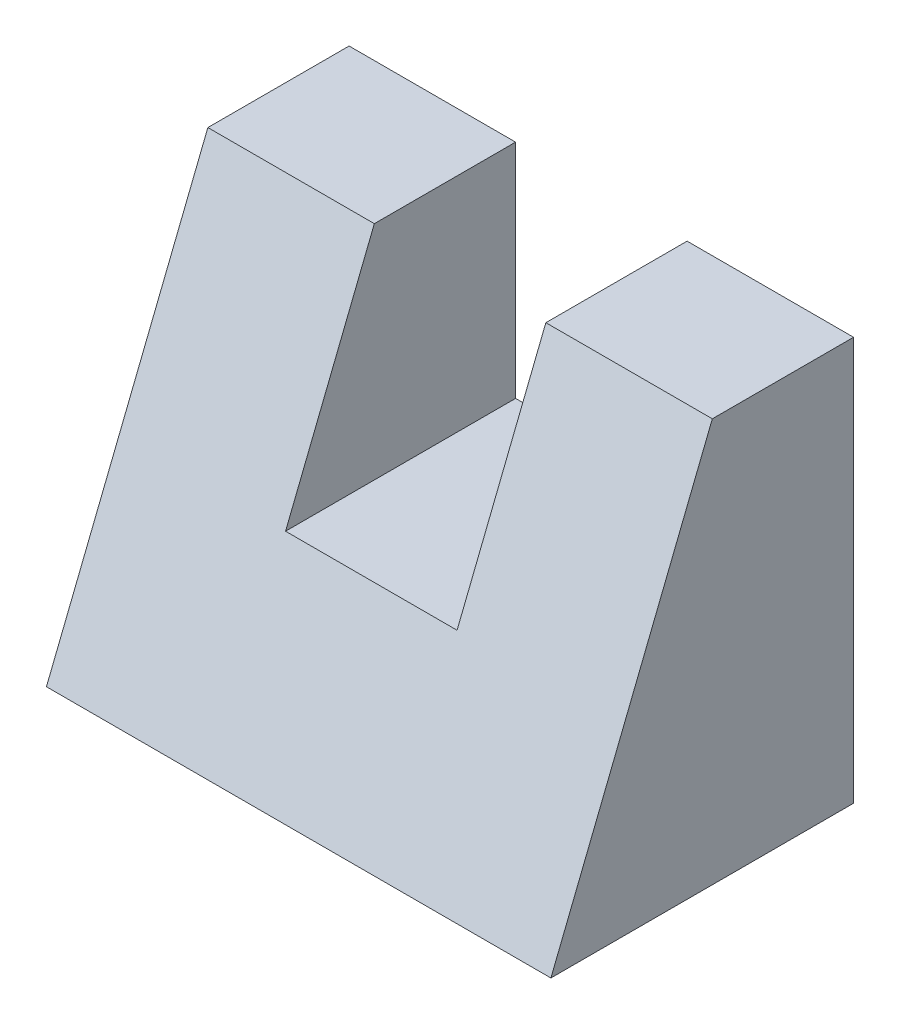
ISO-10303-21;
HEADER;
FILE_DESCRIPTION(('STEP AP214'),'2;1');
FILE_NAME('part.step','',(''),(''),'','','');
FILE_SCHEMA(('AUTOMOTIVE_DESIGN { 1 0 10303 214 1 1 1 1 }'));
ENDSEC;
DATA;
#1=APPLICATION_CONTEXT('core data for automotive mechanical design processes');
#2=APPLICATION_PROTOCOL_DEFINITION('international standard','automotive_design',2000,#1);
#3=PRODUCT_CONTEXT('',#1,'mechanical');
#4=PRODUCT('Part','Part','',(#3));
#5=PRODUCT_RELATED_PRODUCT_CATEGORY('part','',(#4));
#6=PRODUCT_DEFINITION_FORMATION('','',#4);
#7=PRODUCT_DEFINITION_CONTEXT('part definition',#1,'design');
#8=PRODUCT_DEFINITION('design','',#6,#7);
#9=PRODUCT_DEFINITION_SHAPE('','',#8);
#10=(LENGTH_UNIT() NAMED_UNIT(*) SI_UNIT(.MILLI.,.METRE.));
#11=(NAMED_UNIT(*) PLANE_ANGLE_UNIT() SI_UNIT($,.RADIAN.));
#12=(NAMED_UNIT(*) SI_UNIT($,.STERADIAN.) SOLID_ANGLE_UNIT());
#13=UNCERTAINTY_MEASURE_WITH_UNIT(LENGTH_MEASURE(1.E-05),#10,'distance_accuracy_value','');
#14=(GEOMETRIC_REPRESENTATION_CONTEXT(3) GLOBAL_UNCERTAINTY_ASSIGNED_CONTEXT((#13)) GLOBAL_UNIT_ASSIGNED_CONTEXT((#10,
#11,#12)) REPRESENTATION_CONTEXT('',''));
#15=CARTESIAN_POINT('',(0.,0.,0.));
#16=DIRECTION('',(0.,0.,1.));
#17=DIRECTION('',(1.,0.,0.));
#18=AXIS2_PLACEMENT_3D('',#15,#16,#17);
#19=CARTESIAN_POINT('',(0.,80.,0.));
#20=DIRECTION('',(0.,-1.,0.));
#21=DIRECTION('',(0.,0.,-1.));
#22=AXIS2_PLACEMENT_3D('',#19,#20,#21);
#23=PLANE('',#22);
#24=CARTESIAN_POINT('',(0.,80.,28.));
#25=DIRECTION('',(1.,0.,0.));
#26=VECTOR('',#25,1.);
#27=LINE('',#24,#26);
#28=CARTESIAN_POINT('',(0.,80.,28.));
#29=VERTEX_POINT('',#28);
#30=CARTESIAN_POINT('',(33.,80.,28.));
#31=VERTEX_POINT('',#30);
#32=EDGE_CURVE('E350',#29,#31,#27,.T.);
#33=ORIENTED_EDGE('',*,*,#32,.T.);
#34=DIRECTION('',(0.,0.,-1.));
#35=VECTOR('',#34,1.);
#36=CARTESIAN_POINT('',(33.,80.,0.));
#37=LINE('',#36,#35);
#38=CARTESIAN_POINT('',(33.,80.,0.));
#39=VERTEX_POINT('',#38);
#40=EDGE_CURVE('E139',#31,#39,#37,.T.);
#41=ORIENTED_EDGE('',*,*,#40,.T.);
#42=CARTESIAN_POINT('',(0.,80.,0.));
#43=DIRECTION('',(1.,0.,0.));
#44=VECTOR('',#43,1.);
#45=LINE('',#42,#44);
#46=CARTESIAN_POINT('',(0.,80.,0.));
#47=VERTEX_POINT('',#46);
#48=EDGE_CURVE('E360',#47,#39,#45,.T.);
#49=ORIENTED_EDGE('',*,*,#48,.F.);
#50=DIRECTION('',(0.,0.,1.));
#51=VECTOR('',#50,1.);
#52=CARTESIAN_POINT('',(0.,80.,0.));
#53=LINE('',#52,#51);
#54=EDGE_CURVE('E214',#47,#29,#53,.T.);
#55=ORIENTED_EDGE('',*,*,#54,.T.);
#56=EDGE_LOOP('',(#33,#41,#49,#55));
#57=FACE_BOUND('',#56,.T.);
#58=ADVANCED_FACE('F61',(#57),#23,.F.);
#59=CARTESIAN_POINT('',(100.,0.,0.));
#60=DIRECTION('',(1.,0.,0.));
#61=DIRECTION('',(0.,0.,-1.));
#62=AXIS2_PLACEMENT_3D('',#59,#60,#61);
#63=PLANE('',#62);
#64=DIRECTION('',(0.,0.,-1.));
#65=VECTOR('',#64,1.);
#66=CARTESIAN_POINT('',(100.,0.,60.));
#67=LINE('',#66,#65);
#68=CARTESIAN_POINT('',(100.,0.,60.));
#69=VERTEX_POINT('',#68);
#70=CARTESIAN_POINT('',(100.,0.,0.));
#71=VERTEX_POINT('',#70);
#72=EDGE_CURVE('E346',#69,#71,#67,.T.);
#73=ORIENTED_EDGE('',*,*,#72,.T.);
#74=DIRECTION('',(0.,1.,0.));
#75=VECTOR('',#74,1.);
#76=CARTESIAN_POINT('',(100.,0.,0.));
#77=LINE('',#76,#75);
#78=CARTESIAN_POINT('',(100.,80.,0.));
#79=VERTEX_POINT('',#78);
#80=EDGE_CURVE('E341',#71,#79,#77,.T.);
#81=ORIENTED_EDGE('',*,*,#80,.T.);
#82=DIRECTION('',(0.,0.,1.));
#83=VECTOR('',#82,1.);
#84=CARTESIAN_POINT('',(100.,80.,0.));
#85=LINE('',#84,#83);
#86=CARTESIAN_POINT('',(100.,80.,28.));
#87=VERTEX_POINT('',#86);
#88=EDGE_CURVE('E327',#79,#87,#85,.T.);
#89=ORIENTED_EDGE('',*,*,#88,.T.);
#90=DIRECTION('',(0.,-0.928476690885259,0.371390676354104));
#91=VECTOR('',#90,1.);
#92=CARTESIAN_POINT('',(100.,80.,28.));
#93=LINE('',#92,#91);
#94=EDGE_CURVE('E89',#87,#69,#93,.T.);
#95=ORIENTED_EDGE('',*,*,#94,.T.);
#96=EDGE_LOOP('',(#73,#81,#89,#95));
#97=FACE_BOUND('',#96,.T.);
#98=ADVANCED_FACE('F63',(#97),#63,.T.);
#99=CARTESIAN_POINT('',(0.,0.,0.));
#100=DIRECTION('',(1.,0.,0.));
#101=DIRECTION('',(0.,0.,-1.));
#102=AXIS2_PLACEMENT_3D('',#99,#100,#101);
#103=PLANE('',#102);
#104=DIRECTION('',(0.,0.,-1.));
#105=VECTOR('',#104,1.);
#106=CARTESIAN_POINT('',(0.,0.,60.));
#107=LINE('',#106,#105);
#108=CARTESIAN_POINT('',(0.,0.,60.));
#109=VERTEX_POINT('',#108);
#110=CARTESIAN_POINT('',(0.,0.,0.));
#111=VERTEX_POINT('',#110);
#112=EDGE_CURVE('E155',#109,#111,#107,.T.);
#113=ORIENTED_EDGE('',*,*,#112,.F.);
#114=DIRECTION('',(0.,-0.928476690885259,0.371390676354104));
#115=VECTOR('',#114,1.);
#116=CARTESIAN_POINT('',(0.,80.,28.));
#117=LINE('',#116,#115);
#118=EDGE_CURVE('E286',#29,#109,#117,.T.);
#119=ORIENTED_EDGE('',*,*,#118,.F.);
#120=ORIENTED_EDGE('',*,*,#54,.F.);
#121=DIRECTION('',(0.,1.,0.));
#122=VECTOR('',#121,1.);
#123=CARTESIAN_POINT('',(0.,0.,0.));
#124=LINE('',#123,#122);
#125=EDGE_CURVE('E158',#111,#47,#124,.T.);
#126=ORIENTED_EDGE('',*,*,#125,.F.);
#127=EDGE_LOOP('',(#113,#119,#120,#126));
#128=FACE_BOUND('',#127,.T.);
#129=ADVANCED_FACE('F186',(#128),#103,.F.);
#130=CARTESIAN_POINT('',(0.,0.,0.));
#131=DIRECTION('',(0.,0.,1.));
#132=DIRECTION('',(1.,0.,0.));
#133=AXIS2_PLACEMENT_3D('',#130,#131,#132);
#134=PLANE('',#133);
#135=ORIENTED_EDGE('',*,*,#48,.T.);
#136=DIRECTION('',(0.,-1.,0.));
#137=VECTOR('',#136,1.);
#138=CARTESIAN_POINT('',(33.,0.,0.));
#139=LINE('',#138,#137);
#140=CARTESIAN_POINT('',(33.,36.,0.));
#141=VERTEX_POINT('',#140);
#142=EDGE_CURVE('E154',#39,#141,#139,.T.);
#143=ORIENTED_EDGE('',*,*,#142,.T.);
#144=DIRECTION('',(1.,0.,0.));
#145=VECTOR('',#144,1.);
#146=CARTESIAN_POINT('',(0.,36.,0.));
#147=LINE('',#146,#145);
#148=CARTESIAN_POINT('',(67.,36.,0.));
#149=VERTEX_POINT('',#148);
#150=EDGE_CURVE('E145',#141,#149,#147,.T.);
#151=ORIENTED_EDGE('',*,*,#150,.T.);
#152=DIRECTION('',(0.,1.,0.));
#153=VECTOR('',#152,1.);
#154=CARTESIAN_POINT('',(67.,0.,0.));
#155=LINE('',#154,#153);
#156=CARTESIAN_POINT('',(67.,80.,0.));
#157=VERTEX_POINT('',#156);
#158=EDGE_CURVE('E132',#149,#157,#155,.T.);
#159=ORIENTED_EDGE('',*,*,#158,.T.);
#160=CARTESIAN_POINT('',(67.,80.,0.));
#161=DIRECTION('',(1.,0.,0.));
#162=VECTOR('',#161,1.);
#163=LINE('',#160,#162);
#164=EDGE_CURVE('E361',#157,#79,#163,.T.);
#165=ORIENTED_EDGE('',*,*,#164,.T.);
#166=ORIENTED_EDGE('',*,*,#80,.F.);
#167=CARTESIAN_POINT('',(0.,0.,0.));
#168=DIRECTION('',(1.,0.,0.));
#169=VECTOR('',#168,1.);
#170=LINE('',#167,#169);
#171=EDGE_CURVE('E170',#111,#71,#170,.T.);
#172=ORIENTED_EDGE('',*,*,#171,.F.);
#173=ORIENTED_EDGE('',*,*,#125,.T.);
#174=EDGE_LOOP('',(#135,#143,#151,#159,#165,#166,#172,#173));
#175=FACE_BOUND('',#174,.T.);
#176=ADVANCED_FACE('F153',(#175),#134,.F.);
#177=CARTESIAN_POINT('',(0.,0.,0.));
#178=DIRECTION('',(0.,1.,0.));
#179=DIRECTION('',(0.,0.,1.));
#180=AXIS2_PLACEMENT_3D('',#177,#178,#179);
#181=PLANE('',#180);
#182=ORIENTED_EDGE('',*,*,#171,.T.);
#183=ORIENTED_EDGE('',*,*,#72,.F.);
#184=CARTESIAN_POINT('',(0.,0.,60.));
#185=DIRECTION('',(1.,0.,0.));
#186=VECTOR('',#185,1.);
#187=LINE('',#184,#186);
#188=EDGE_CURVE('E276',#109,#69,#187,.T.);
#189=ORIENTED_EDGE('',*,*,#188,.F.);
#190=ORIENTED_EDGE('',*,*,#112,.T.);
#191=EDGE_LOOP('',(#182,#183,#189,#190));
#192=FACE_BOUND('',#191,.T.);
#193=ADVANCED_FACE('F185',(#192),#181,.F.);
#194=ORIENTED_EDGE('',*,*,#164,.F.);
#195=DIRECTION('',(0.,0.,1.));
#196=VECTOR('',#195,1.);
#197=CARTESIAN_POINT('',(67.,80.,0.));
#198=LINE('',#197,#196);
#199=CARTESIAN_POINT('',(67.,80.,28.));
#200=VERTEX_POINT('',#199);
#201=EDGE_CURVE('E135',#157,#200,#198,.T.);
#202=ORIENTED_EDGE('',*,*,#201,.T.);
#203=CARTESIAN_POINT('',(67.,80.,28.));
#204=DIRECTION('',(1.,0.,0.));
#205=VECTOR('',#204,1.);
#206=LINE('',#203,#205);
#207=EDGE_CURVE('E256',#200,#87,#206,.T.);
#208=ORIENTED_EDGE('',*,*,#207,.T.);
#209=ORIENTED_EDGE('',*,*,#88,.F.);
#210=EDGE_LOOP('',(#194,#202,#208,#209));
#211=FACE_BOUND('',#210,.T.);
#212=ADVANCED_FACE('F220',(#211),#23,.F.);
#213=CARTESIAN_POINT('',(0.,20.6896551724138,51.7241379310345));
#214=DIRECTION('',(0.,-0.371390676354104,-0.928476690885259));
#215=DIRECTION('',(0.,0.928476690885259,-0.371390676354104));
#216=AXIS2_PLACEMENT_3D('',#213,#214,#215);
#217=PLANE('',#216);
#218=DIRECTION('',(-1.,0.,0.));
#219=VECTOR('',#218,1.);
#220=CARTESIAN_POINT('',(0.,36.,45.6));
#221=LINE('',#220,#219);
#222=CARTESIAN_POINT('',(67.,36.,45.6));
#223=VERTEX_POINT('',#222);
#224=CARTESIAN_POINT('',(33.,36.,45.6));
#225=VERTEX_POINT('',#224);
#226=EDGE_CURVE('E72',#223,#225,#221,.T.);
#227=ORIENTED_EDGE('',*,*,#226,.T.);
#228=DIRECTION('',(0.,0.928476690885259,-0.371390676354104));
#229=VECTOR('',#228,1.);
#230=CARTESIAN_POINT('',(33.,20.6896551724138,51.7241379310345));
#231=LINE('',#230,#229);
#232=EDGE_CURVE('E12',#225,#31,#231,.T.);
#233=ORIENTED_EDGE('',*,*,#232,.T.);
#234=ORIENTED_EDGE('',*,*,#32,.F.);
#235=ORIENTED_EDGE('',*,*,#118,.T.);
#236=ORIENTED_EDGE('',*,*,#188,.T.);
#237=ORIENTED_EDGE('',*,*,#94,.F.);
#238=ORIENTED_EDGE('',*,*,#207,.F.);
#239=DIRECTION('',(0.,-0.928476690885259,0.371390676354104));
#240=VECTOR('',#239,1.);
#241=CARTESIAN_POINT('',(67.,20.6896551724138,51.7241379310345));
#242=LINE('',#241,#240);
#243=EDGE_CURVE('E262',#200,#223,#242,.T.);
#244=ORIENTED_EDGE('',*,*,#243,.T.);
#245=EDGE_LOOP('',(#227,#233,#234,#235,#236,#237,#238,#244));
#246=FACE_BOUND('',#245,.T.);
#247=ADVANCED_FACE('F228',(#246),#217,.F.);
#248=CARTESIAN_POINT('',(0.,36.,0.));
#249=DIRECTION('',(0.,-1.,0.));
#250=DIRECTION('',(0.,0.,-1.));
#251=AXIS2_PLACEMENT_3D('',#248,#249,#250);
#252=PLANE('',#251);
#253=DIRECTION('',(0.,0.,-1.));
#254=VECTOR('',#253,1.);
#255=CARTESIAN_POINT('',(33.,36.,70.));
#256=LINE('',#255,#254);
#257=EDGE_CURVE('E66',#225,#141,#256,.T.);
#258=ORIENTED_EDGE('',*,*,#257,.F.);
#259=ORIENTED_EDGE('',*,*,#226,.F.);
#260=DIRECTION('',(0.,0.,1.));
#261=VECTOR('',#260,1.);
#262=CARTESIAN_POINT('',(67.,36.,-5.));
#263=LINE('',#262,#261);
#264=EDGE_CURVE('E80',#149,#223,#263,.T.);
#265=ORIENTED_EDGE('',*,*,#264,.F.);
#266=ORIENTED_EDGE('',*,*,#150,.F.);
#267=EDGE_LOOP('',(#258,#259,#265,#266));
#268=FACE_BOUND('',#267,.T.);
#269=ADVANCED_FACE('F144',(#268),#252,.F.);
#270=CARTESIAN_POINT('',(33.,0.,0.));
#271=DIRECTION('',(-1.,0.,0.));
#272=DIRECTION('',(0.,0.,1.));
#273=AXIS2_PLACEMENT_3D('',#270,#271,#272);
#274=PLANE('',#273);
#275=ORIENTED_EDGE('',*,*,#40,.F.);
#276=ORIENTED_EDGE('',*,*,#232,.F.);
#277=ORIENTED_EDGE('',*,*,#257,.T.);
#278=ORIENTED_EDGE('',*,*,#142,.F.);
#279=EDGE_LOOP('',(#275,#276,#277,#278));
#280=FACE_BOUND('',#279,.T.);
#281=ADVANCED_FACE('F434',(#280),#274,.F.);
#282=CARTESIAN_POINT('',(67.,0.,0.));
#283=DIRECTION('',(1.,0.,0.));
#284=DIRECTION('',(0.,0.,-1.));
#285=AXIS2_PLACEMENT_3D('',#282,#283,#284);
#286=PLANE('',#285);
#287=ORIENTED_EDGE('',*,*,#264,.T.);
#288=ORIENTED_EDGE('',*,*,#243,.F.);
#289=ORIENTED_EDGE('',*,*,#201,.F.);
#290=ORIENTED_EDGE('',*,*,#158,.F.);
#291=EDGE_LOOP('',(#287,#288,#289,#290));
#292=FACE_BOUND('',#291,.T.);
#293=ADVANCED_FACE('F133',(#292),#286,.F.);
#294=CLOSED_SHELL('',(#58,#98,#129,#176,#193,#212,#247,#269,#281,#293));
#295=MANIFOLD_SOLID_BREP('B2',#294);
#296=ADVANCED_BREP_SHAPE_REPRESENTATION('',(#18,#295),#14);
#297=SHAPE_DEFINITION_REPRESENTATION(#9,#296);
ENDSEC;
END-ISO-10303-21;
